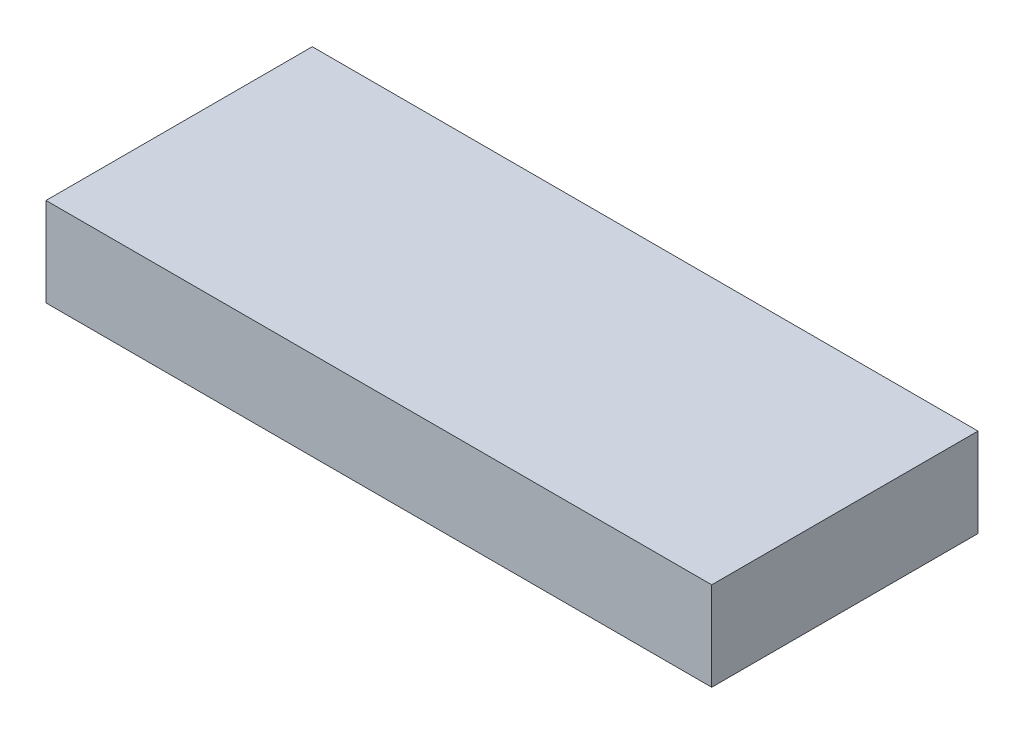
ISO-10303-21;
HEADER;
FILE_DESCRIPTION(('STEP AP214'),'2;1');
FILE_NAME('part.step','',(''),(''),'','','');
FILE_SCHEMA(('AUTOMOTIVE_DESIGN { 1 0 10303 214 1 1 1 1 }'));
ENDSEC;
DATA;
#1=APPLICATION_CONTEXT('core data for automotive mechanical design processes');
#2=APPLICATION_PROTOCOL_DEFINITION('international standard','automotive_design',2000,#1);
#3=PRODUCT_CONTEXT('',#1,'mechanical');
#4=PRODUCT('Part','Part','',(#3));
#5=PRODUCT_RELATED_PRODUCT_CATEGORY('part','',(#4));
#6=PRODUCT_DEFINITION_FORMATION('','',#4);
#7=PRODUCT_DEFINITION_CONTEXT('part definition',#1,'design');
#8=PRODUCT_DEFINITION('design','',#6,#7);
#9=PRODUCT_DEFINITION_SHAPE('','',#8);
#10=(LENGTH_UNIT() NAMED_UNIT(*) SI_UNIT(.MILLI.,.METRE.));
#11=(NAMED_UNIT(*) PLANE_ANGLE_UNIT() SI_UNIT($,.RADIAN.));
#12=(NAMED_UNIT(*) SI_UNIT($,.STERADIAN.) SOLID_ANGLE_UNIT());
#13=UNCERTAINTY_MEASURE_WITH_UNIT(LENGTH_MEASURE(1.E-05),#10,'distance_accuracy_value','');
#14=(GEOMETRIC_REPRESENTATION_CONTEXT(3) GLOBAL_UNCERTAINTY_ASSIGNED_CONTEXT((#13)) GLOBAL_UNIT_ASSIGNED_CONTEXT((#10,
#11,#12)) REPRESENTATION_CONTEXT('',''));
#15=CARTESIAN_POINT('',(0.,0.,0.));
#16=DIRECTION('',(0.,0.,1.));
#17=DIRECTION('',(1.,0.,0.));
#18=AXIS2_PLACEMENT_3D('',#15,#16,#17);
#19=CARTESIAN_POINT('',(-21.7792963159643,8.,-8.52732670463394));
#20=DIRECTION('',(1.,0.,0.));
#21=DIRECTION('',(0.,0.,-1.));
#22=AXIS2_PLACEMENT_3D('',#19,#20,#21);
#23=PLANE('',#22);
#24=DIRECTION('',(0.,0.,1.));
#25=VECTOR('',#24,1.);
#26=CARTESIAN_POINT('',(-21.7792963159643,0.,-8.52732670463394));
#27=LINE('',#26,#25);
#28=CARTESIAN_POINT('',(-21.7792963159643,0.,-8.52732670463394));
#29=VERTEX_POINT('',#28);
#30=CARTESIAN_POINT('',(-21.7792963159643,0.,15.4726732953661));
#31=VERTEX_POINT('',#30);
#32=EDGE_CURVE('E93',#29,#31,#27,.T.);
#33=ORIENTED_EDGE('',*,*,#32,.T.);
#34=DIRECTION('',(0.,-1.,0.));
#35=VECTOR('',#34,1.);
#36=CARTESIAN_POINT('',(-21.7792963159643,8.,15.4726732953661));
#37=LINE('',#36,#35);
#38=CARTESIAN_POINT('',(-21.7792963159643,8.,15.4726732953661));
#39=VERTEX_POINT('',#38);
#40=EDGE_CURVE('E11',#39,#31,#37,.T.);
#41=ORIENTED_EDGE('',*,*,#40,.F.);
#42=DIRECTION('',(0.,0.,1.));
#43=VECTOR('',#42,1.);
#44=CARTESIAN_POINT('',(-21.7792963159643,8.,-8.52732670463394));
#45=LINE('',#44,#43);
#46=CARTESIAN_POINT('',(-21.7792963159643,8.,-8.52732670463394));
#47=VERTEX_POINT('',#46);
#48=EDGE_CURVE('E81',#47,#39,#45,.T.);
#49=ORIENTED_EDGE('',*,*,#48,.F.);
#50=DIRECTION('',(0.,-1.,0.));
#51=VECTOR('',#50,1.);
#52=CARTESIAN_POINT('',(-21.7792963159643,8.,-8.52732670463394));
#53=LINE('',#52,#51);
#54=EDGE_CURVE('E89',#47,#29,#53,.T.);
#55=ORIENTED_EDGE('',*,*,#54,.T.);
#56=EDGE_LOOP('',(#33,#41,#49,#55));
#57=FACE_BOUND('',#56,.T.);
#58=ADVANCED_FACE('F30',(#57),#23,.F.);
#59=CARTESIAN_POINT('',(-21.7792963159643,8.,15.4726732953661));
#60=DIRECTION('',(0.,0.,-1.));
#61=DIRECTION('',(-1.,0.,0.));
#62=AXIS2_PLACEMENT_3D('',#59,#60,#61);
#63=PLANE('',#62);
#64=DIRECTION('',(1.,0.,0.));
#65=VECTOR('',#64,1.);
#66=CARTESIAN_POINT('',(-21.7792963159643,0.,15.4726732953661));
#67=LINE('',#66,#65);
#68=CARTESIAN_POINT('',(38.2207036840357,0.,15.4726732953661));
#69=VERTEX_POINT('',#68);
#70=EDGE_CURVE('E85',#31,#69,#67,.T.);
#71=ORIENTED_EDGE('',*,*,#70,.T.);
#72=DIRECTION('',(0.,-1.,0.));
#73=VECTOR('',#72,1.);
#74=CARTESIAN_POINT('',(38.2207036840357,8.,15.4726732953661));
#75=LINE('',#74,#73);
#76=CARTESIAN_POINT('',(38.2207036840357,8.,15.4726732953661));
#77=VERTEX_POINT('',#76);
#78=EDGE_CURVE('E38',#77,#69,#75,.T.);
#79=ORIENTED_EDGE('',*,*,#78,.F.);
#80=DIRECTION('',(1.,0.,0.));
#81=VECTOR('',#80,1.);
#82=CARTESIAN_POINT('',(-21.7792963159643,8.,15.4726732953661));
#83=LINE('',#82,#81);
#84=EDGE_CURVE('E76',#39,#77,#83,.T.);
#85=ORIENTED_EDGE('',*,*,#84,.F.);
#86=ORIENTED_EDGE('',*,*,#40,.T.);
#87=EDGE_LOOP('',(#71,#79,#85,#86));
#88=FACE_BOUND('',#87,.T.);
#89=ADVANCED_FACE('F84',(#88),#63,.F.);
#90=CARTESIAN_POINT('',(38.2207036840357,8.,-8.52732670463394));
#91=DIRECTION('',(-1.,0.,0.));
#92=DIRECTION('',(0.,0.,1.));
#93=AXIS2_PLACEMENT_3D('',#90,#91,#92);
#94=PLANE('',#93);
#95=DIRECTION('',(0.,0.,-1.));
#96=VECTOR('',#95,1.);
#97=CARTESIAN_POINT('',(38.2207036840357,0.,-8.52732670463394));
#98=LINE('',#97,#96);
#99=CARTESIAN_POINT('',(38.2207036840357,0.,-8.52732670463394));
#100=VERTEX_POINT('',#99);
#101=EDGE_CURVE('E63',#69,#100,#98,.T.);
#102=ORIENTED_EDGE('',*,*,#101,.T.);
#103=DIRECTION('',(0.,-1.,0.));
#104=VECTOR('',#103,1.);
#105=CARTESIAN_POINT('',(38.2207036840357,8.,-8.52732670463394));
#106=LINE('',#105,#104);
#107=CARTESIAN_POINT('',(38.2207036840357,8.,-8.52732670463394));
#108=VERTEX_POINT('',#107);
#109=EDGE_CURVE('E86',#108,#100,#106,.T.);
#110=ORIENTED_EDGE('',*,*,#109,.F.);
#111=DIRECTION('',(0.,0.,-1.));
#112=VECTOR('',#111,1.);
#113=CARTESIAN_POINT('',(38.2207036840357,8.,-8.52732670463394));
#114=LINE('',#113,#112);
#115=EDGE_CURVE('E79',#77,#108,#114,.T.);
#116=ORIENTED_EDGE('',*,*,#115,.F.);
#117=ORIENTED_EDGE('',*,*,#78,.T.);
#118=EDGE_LOOP('',(#102,#110,#116,#117));
#119=FACE_BOUND('',#118,.T.);
#120=ADVANCED_FACE('F87',(#119),#94,.F.);
#121=CARTESIAN_POINT('',(-21.7792963159643,8.,-8.52732670463394));
#122=DIRECTION('',(0.,0.,1.));
#123=DIRECTION('',(1.,0.,0.));
#124=AXIS2_PLACEMENT_3D('',#121,#122,#123);
#125=PLANE('',#124);
#126=DIRECTION('',(-1.,0.,0.));
#127=VECTOR('',#126,1.);
#128=CARTESIAN_POINT('',(-21.7792963159643,0.,-8.52732670463394));
#129=LINE('',#128,#127);
#130=EDGE_CURVE('E69',#100,#29,#129,.T.);
#131=ORIENTED_EDGE('',*,*,#130,.T.);
#132=ORIENTED_EDGE('',*,*,#54,.F.);
#133=DIRECTION('',(-1.,0.,0.));
#134=VECTOR('',#133,1.);
#135=CARTESIAN_POINT('',(-21.7792963159643,8.,-8.52732670463394));
#136=LINE('',#135,#134);
#137=EDGE_CURVE('E46',#108,#47,#136,.T.);
#138=ORIENTED_EDGE('',*,*,#137,.F.);
#139=ORIENTED_EDGE('',*,*,#109,.T.);
#140=EDGE_LOOP('',(#131,#132,#138,#139));
#141=FACE_BOUND('',#140,.T.);
#142=ADVANCED_FACE('F100',(#141),#125,.F.);
#143=CARTESIAN_POINT('',(-21.7792963159643,8.,15.4726732953661));
#144=DIRECTION('',(0.,1.,0.));
#145=DIRECTION('',(0.,0.,1.));
#146=AXIS2_PLACEMENT_3D('',#143,#144,#145);
#147=PLANE('',#146);
#148=ORIENTED_EDGE('',*,*,#48,.T.);
#149=ORIENTED_EDGE('',*,*,#84,.T.);
#150=ORIENTED_EDGE('',*,*,#115,.T.);
#151=ORIENTED_EDGE('',*,*,#137,.T.);
#152=EDGE_LOOP('',(#148,#149,#150,#151));
#153=FACE_BOUND('',#152,.T.);
#154=ADVANCED_FACE('F77',(#153),#147,.T.);
#155=CARTESIAN_POINT('',(-21.7792963159643,0.,15.4726732953661));
#156=DIRECTION('',(0.,1.,0.));
#157=DIRECTION('',(0.,0.,1.));
#158=AXIS2_PLACEMENT_3D('',#155,#156,#157);
#159=PLANE('',#158);
#160=ORIENTED_EDGE('',*,*,#32,.F.);
#161=ORIENTED_EDGE('',*,*,#130,.F.);
#162=ORIENTED_EDGE('',*,*,#101,.F.);
#163=ORIENTED_EDGE('',*,*,#70,.F.);
#164=EDGE_LOOP('',(#160,#161,#162,#163));
#165=FACE_BOUND('',#164,.T.);
#166=ADVANCED_FACE('F103',(#165),#159,.F.);
#167=CLOSED_SHELL('',(#58,#89,#120,#142,#154,#166));
#168=MANIFOLD_SOLID_BREP('B2',#167);
#169=ADVANCED_BREP_SHAPE_REPRESENTATION('',(#18,#168),#14);
#170=SHAPE_DEFINITION_REPRESENTATION(#9,#169);
ENDSEC;
END-ISO-10303-21;
